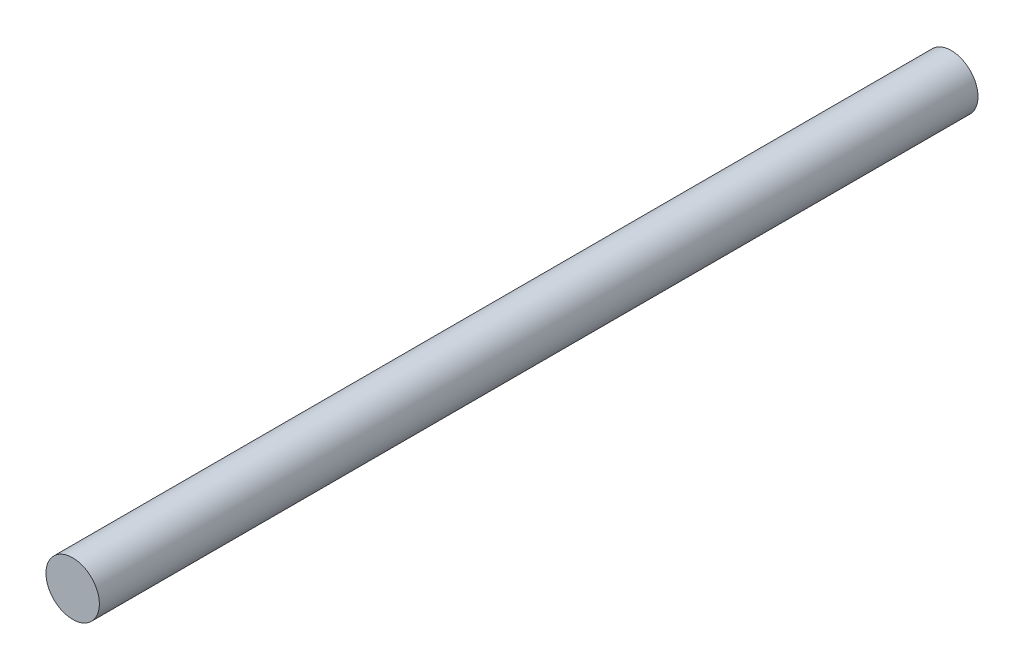
ISO-10303-21;
HEADER;
FILE_DESCRIPTION(('STEP AP214'),'2;1');
FILE_NAME('part.step','',(''),(''),'','','');
FILE_SCHEMA(('AUTOMOTIVE_DESIGN { 1 0 10303 214 1 1 1 1 }'));
ENDSEC;
DATA;
#1=APPLICATION_CONTEXT('core data for automotive mechanical design processes');
#2=APPLICATION_PROTOCOL_DEFINITION('international standard','automotive_design',2000,#1);
#3=PRODUCT_CONTEXT('',#1,'mechanical');
#4=PRODUCT('Part','Part','',(#3));
#5=PRODUCT_RELATED_PRODUCT_CATEGORY('part','',(#4));
#6=PRODUCT_DEFINITION_FORMATION('','',#4);
#7=PRODUCT_DEFINITION_CONTEXT('part definition',#1,'design');
#8=PRODUCT_DEFINITION('design','',#6,#7);
#9=PRODUCT_DEFINITION_SHAPE('','',#8);
#10=(LENGTH_UNIT() NAMED_UNIT(*) SI_UNIT(.MILLI.,.METRE.));
#11=(NAMED_UNIT(*) PLANE_ANGLE_UNIT() SI_UNIT($,.RADIAN.));
#12=(NAMED_UNIT(*) SI_UNIT($,.STERADIAN.) SOLID_ANGLE_UNIT());
#13=UNCERTAINTY_MEASURE_WITH_UNIT(LENGTH_MEASURE(1.E-05),#10,'distance_accuracy_value','');
#14=(GEOMETRIC_REPRESENTATION_CONTEXT(3) GLOBAL_UNCERTAINTY_ASSIGNED_CONTEXT((#13)) GLOBAL_UNIT_ASSIGNED_CONTEXT((#10,
#11,#12)) REPRESENTATION_CONTEXT('',''));
#15=CARTESIAN_POINT('',(0.,0.,0.));
#16=DIRECTION('',(0.,0.,1.));
#17=DIRECTION('',(1.,0.,0.));
#18=AXIS2_PLACEMENT_3D('',#15,#16,#17);
#19=CARTESIAN_POINT('',(0.,0.,-64.));
#20=DIRECTION('',(0.,0.,1.));
#21=DIRECTION('',(1.,0.,0.));
#22=AXIS2_PLACEMENT_3D('',#19,#20,#21);
#23=CYLINDRICAL_SURFACE('',#22,2.25);
#24=CARTESIAN_POINT('',(0.,0.,-64.));
#25=DIRECTION('',(0.,0.,1.));
#26=DIRECTION('',(1.,0.,0.));
#27=AXIS2_PLACEMENT_3D('',#24,#25,#26);
#28=CIRCLE('',#27,2.25);
#29=CARTESIAN_POINT('',(2.25,0.,-64.));
#30=VERTEX_POINT('',#29);
#31=EDGE_CURVE('E10',#30,#30,#28,.T.);
#32=ORIENTED_EDGE('',*,*,#31,.T.);
#33=EDGE_LOOP('',(#32));
#34=FACE_BOUND('',#33,.T.);
#35=CARTESIAN_POINT('',(0.,0.,10.));
#36=DIRECTION('',(0.,0.,1.));
#37=DIRECTION('',(1.,0.,0.));
#38=AXIS2_PLACEMENT_3D('',#35,#36,#37);
#39=CIRCLE('',#38,2.25);
#40=CARTESIAN_POINT('',(2.25,0.,10.));
#41=VERTEX_POINT('',#40);
#42=EDGE_CURVE('E39',#41,#41,#39,.T.);
#43=ORIENTED_EDGE('',*,*,#42,.F.);
#44=EDGE_LOOP('',(#43));
#45=FACE_BOUND('',#44,.T.);
#46=ADVANCED_FACE('F33',(#34,#45),#23,.T.);
#47=CARTESIAN_POINT('',(0.,0.,-64.));
#48=DIRECTION('',(0.,0.,1.));
#49=DIRECTION('',(1.,0.,0.));
#50=AXIS2_PLACEMENT_3D('',#47,#48,#49);
#51=PLANE('',#50);
#52=ORIENTED_EDGE('',*,*,#31,.F.);
#53=EDGE_LOOP('',(#52));
#54=FACE_BOUND('',#53,.T.);
#55=ADVANCED_FACE('F48',(#54),#51,.F.);
#56=CARTESIAN_POINT('',(0.,0.,10.));
#57=DIRECTION('',(0.,0.,1.));
#58=DIRECTION('',(1.,0.,0.));
#59=AXIS2_PLACEMENT_3D('',#56,#57,#58);
#60=PLANE('',#59);
#61=ORIENTED_EDGE('',*,*,#42,.T.);
#62=EDGE_LOOP('',(#61));
#63=FACE_BOUND('',#62,.T.);
#64=ADVANCED_FACE('F45',(#63),#60,.T.);
#65=CLOSED_SHELL('',(#46,#55,#64));
#66=MANIFOLD_SOLID_BREP('B2',#65);
#67=ADVANCED_BREP_SHAPE_REPRESENTATION('',(#18,#66),#14);
#68=SHAPE_DEFINITION_REPRESENTATION(#9,#67);
ENDSEC;
END-ISO-10303-21;
